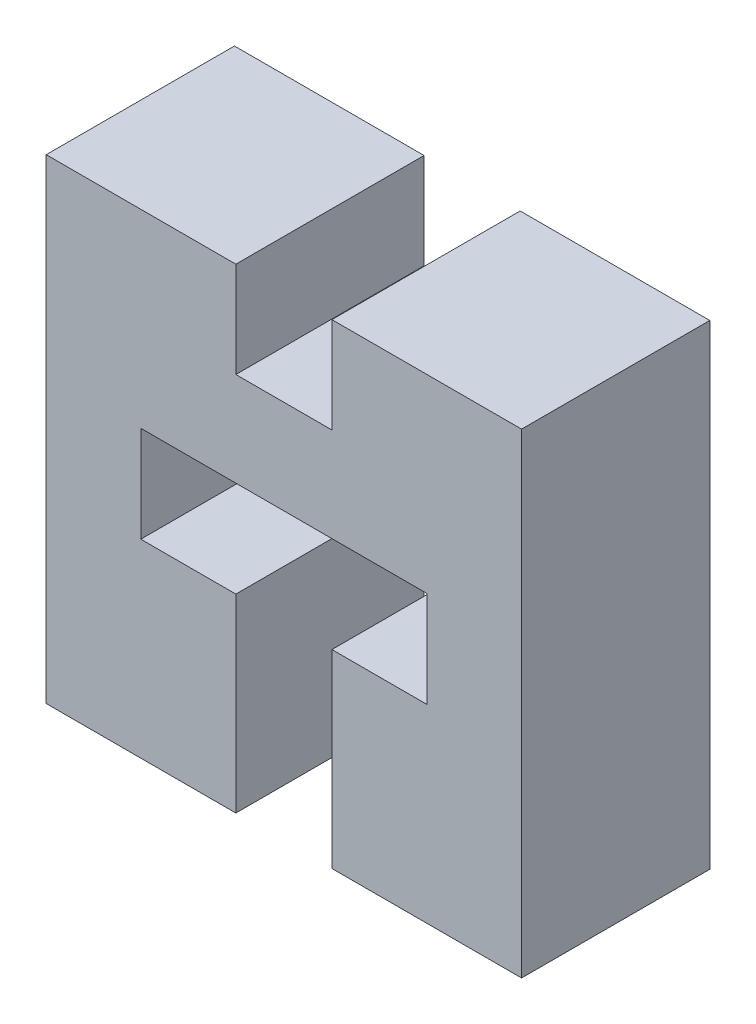
ISO-10303-21;
HEADER;
FILE_DESCRIPTION(('STEP AP214'),'2;1');
FILE_NAME('part.step','',(''),(''),'','','');
FILE_SCHEMA(('AUTOMOTIVE_DESIGN { 1 0 10303 214 1 1 1 1 }'));
ENDSEC;
DATA;
#1=APPLICATION_CONTEXT('core data for automotive mechanical design processes');
#2=APPLICATION_PROTOCOL_DEFINITION('international standard','automotive_design',2000,#1);
#3=PRODUCT_CONTEXT('',#1,'mechanical');
#4=PRODUCT('Part','Part','',(#3));
#5=PRODUCT_RELATED_PRODUCT_CATEGORY('part','',(#4));
#6=PRODUCT_DEFINITION_FORMATION('','',#4);
#7=PRODUCT_DEFINITION_CONTEXT('part definition',#1,'design');
#8=PRODUCT_DEFINITION('design','',#6,#7);
#9=PRODUCT_DEFINITION_SHAPE('','',#8);
#10=(LENGTH_UNIT() NAMED_UNIT(*) SI_UNIT(.MILLI.,.METRE.));
#11=(NAMED_UNIT(*) PLANE_ANGLE_UNIT() SI_UNIT($,.RADIAN.));
#12=(NAMED_UNIT(*) SI_UNIT($,.STERADIAN.) SOLID_ANGLE_UNIT());
#13=UNCERTAINTY_MEASURE_WITH_UNIT(LENGTH_MEASURE(1.E-05),#10,'distance_accuracy_value','');
#14=(GEOMETRIC_REPRESENTATION_CONTEXT(3) GLOBAL_UNCERTAINTY_ASSIGNED_CONTEXT((#13)) GLOBAL_UNIT_ASSIGNED_CONTEXT((#10,
#11,#12)) REPRESENTATION_CONTEXT('',''));
#15=CARTESIAN_POINT('',(0.,0.,0.));
#16=DIRECTION('',(0.,0.,1.));
#17=DIRECTION('',(1.,0.,0.));
#18=AXIS2_PLACEMENT_3D('',#15,#16,#17);
#19=CARTESIAN_POINT('',(19.9734994027987,9.97349977532775,0.));
#20=DIRECTION('',(0.,1.,0.));
#21=DIRECTION('',(0.,0.,1.));
#22=AXIS2_PLACEMENT_3D('',#19,#20,#21);
#23=PLANE('',#22);
#24=DIRECTION('',(-1.,0.,0.));
#25=VECTOR('',#24,1.);
#26=CARTESIAN_POINT('',(19.9734994027987,9.97349977532775,9.89999994635582));
#27=LINE('',#26,#25);
#28=CARTESIAN_POINT('',(19.9734994027987,9.97349977532775,9.89999994635582));
#29=VERTEX_POINT('',#28);
#30=CARTESIAN_POINT('',(14.9739997092783,9.97349977532775,9.89999994635582));
#31=VERTEX_POINT('',#30);
#32=EDGE_CURVE('E194',#29,#31,#27,.T.);
#33=ORIENTED_EDGE('',*,*,#32,.F.);
#34=DIRECTION('',(0.,0.,1.));
#35=VECTOR('',#34,1.);
#36=CARTESIAN_POINT('',(19.9734994027987,9.97349977532775,0.));
#37=LINE('',#36,#35);
#38=CARTESIAN_POINT('',(19.9734994027987,9.97349977532775,0.));
#39=VERTEX_POINT('',#38);
#40=EDGE_CURVE('E11',#39,#29,#37,.T.);
#41=ORIENTED_EDGE('',*,*,#40,.F.);
#42=DIRECTION('',(-1.,0.,0.));
#43=VECTOR('',#42,1.);
#44=CARTESIAN_POINT('',(19.9734994027987,9.97349977532775,0.));
#45=LINE('',#44,#43);
#46=CARTESIAN_POINT('',(14.9739997092783,9.97349977532775,0.));
#47=VERTEX_POINT('',#46);
#48=EDGE_CURVE('E254',#39,#47,#45,.T.);
#49=ORIENTED_EDGE('',*,*,#48,.T.);
#50=DIRECTION('',(0.,0.,1.));
#51=VECTOR('',#50,1.);
#52=CARTESIAN_POINT('',(14.9739997092783,9.97349977532775,0.));
#53=LINE('',#52,#51);
#54=EDGE_CURVE('E46',#47,#31,#53,.T.);
#55=ORIENTED_EDGE('',*,*,#54,.T.);
#56=EDGE_LOOP('',(#33,#41,#49,#55));
#57=FACE_BOUND('',#56,.T.);
#58=ADVANCED_FACE('F43',(#57),#23,.T.);
#59=CARTESIAN_POINT('',(19.9734994027987,0.,0.));
#60=DIRECTION('',(1.,0.,0.));
#61=DIRECTION('',(0.,0.,-1.));
#62=AXIS2_PLACEMENT_3D('',#59,#60,#61);
#63=PLANE('',#62);
#64=DIRECTION('',(0.,1.,0.));
#65=VECTOR('',#64,1.);
#66=CARTESIAN_POINT('',(19.9734994027987,0.,9.89999994635582));
#67=LINE('',#66,#65);
#68=CARTESIAN_POINT('',(19.9734994027987,0.,9.89999994635582));
#69=VERTEX_POINT('',#68);
#70=EDGE_CURVE('E251',#69,#29,#67,.T.);
#71=ORIENTED_EDGE('',*,*,#70,.F.);
#72=DIRECTION('',(0.,0.,1.));
#73=VECTOR('',#72,1.);
#74=CARTESIAN_POINT('',(19.9734994027987,0.,0.));
#75=LINE('',#74,#73);
#76=CARTESIAN_POINT('',(19.9734994027987,0.,0.));
#77=VERTEX_POINT('',#76);
#78=EDGE_CURVE('E53',#77,#69,#75,.T.);
#79=ORIENTED_EDGE('',*,*,#78,.F.);
#80=DIRECTION('',(0.,1.,0.));
#81=VECTOR('',#80,1.);
#82=CARTESIAN_POINT('',(19.9734994027987,0.,0.));
#83=LINE('',#82,#81);
#84=EDGE_CURVE('E180',#77,#39,#83,.T.);
#85=ORIENTED_EDGE('',*,*,#84,.T.);
#86=ORIENTED_EDGE('',*,*,#40,.T.);
#87=EDGE_LOOP('',(#71,#79,#85,#86));
#88=FACE_BOUND('',#87,.T.);
#89=ADVANCED_FACE('F296',(#88),#63,.T.);
#90=CARTESIAN_POINT('',(9.99999962747098,0.,0.));
#91=DIRECTION('',(0.,-1.,0.));
#92=DIRECTION('',(0.,0.,-1.));
#93=AXIS2_PLACEMENT_3D('',#90,#91,#92);
#94=PLANE('',#93);
#95=DIRECTION('',(1.,0.,0.));
#96=VECTOR('',#95,1.);
#97=CARTESIAN_POINT('',(9.99999962747098,0.,9.89999994635582));
#98=LINE('',#97,#96);
#99=CARTESIAN_POINT('',(9.99999962747098,0.,9.89999994635582));
#100=VERTEX_POINT('',#99);
#101=EDGE_CURVE('E166',#100,#69,#98,.T.);
#102=ORIENTED_EDGE('',*,*,#101,.F.);
#103=DIRECTION('',(0.,0.,1.));
#104=VECTOR('',#103,1.);
#105=CARTESIAN_POINT('',(9.99999962747098,0.,0.));
#106=LINE('',#105,#104);
#107=CARTESIAN_POINT('',(9.99999962747098,0.,0.));
#108=VERTEX_POINT('',#107);
#109=EDGE_CURVE('E161',#108,#100,#106,.T.);
#110=ORIENTED_EDGE('',*,*,#109,.F.);
#111=DIRECTION('',(1.,0.,0.));
#112=VECTOR('',#111,1.);
#113=CARTESIAN_POINT('',(9.99999962747098,0.,0.));
#114=LINE('',#113,#112);
#115=EDGE_CURVE('E164',#108,#77,#114,.T.);
#116=ORIENTED_EDGE('',*,*,#115,.T.);
#117=ORIENTED_EDGE('',*,*,#78,.T.);
#118=EDGE_LOOP('',(#102,#110,#116,#117));
#119=FACE_BOUND('',#118,.T.);
#120=ADVANCED_FACE('F163',(#119),#94,.T.);
#121=CARTESIAN_POINT('',(9.99999962747098,25.,0.));
#122=DIRECTION('',(-1.,0.,0.));
#123=DIRECTION('',(0.,0.,1.));
#124=AXIS2_PLACEMENT_3D('',#121,#122,#123);
#125=PLANE('',#124);
#126=DIRECTION('',(0.,-1.,0.));
#127=VECTOR('',#126,1.);
#128=CARTESIAN_POINT('',(9.99999962747098,25.,9.89999994635582));
#129=LINE('',#128,#127);
#130=CARTESIAN_POINT('',(9.99999962747098,25.,9.89999994635582));
#131=VERTEX_POINT('',#130);
#132=EDGE_CURVE('E246',#131,#100,#129,.T.);
#133=ORIENTED_EDGE('',*,*,#132,.F.);
#134=DIRECTION('',(0.,0.,1.));
#135=VECTOR('',#134,1.);
#136=CARTESIAN_POINT('',(9.99999962747098,25.,0.));
#137=LINE('',#136,#135);
#138=CARTESIAN_POINT('',(9.99999962747098,25.,0.));
#139=VERTEX_POINT('',#138);
#140=EDGE_CURVE('E172',#139,#131,#137,.T.);
#141=ORIENTED_EDGE('',*,*,#140,.F.);
#142=DIRECTION('',(0.,-1.,0.));
#143=VECTOR('',#142,1.);
#144=CARTESIAN_POINT('',(9.99999962747098,25.,0.));
#145=LINE('',#144,#143);
#146=EDGE_CURVE('E178',#139,#108,#145,.T.);
#147=ORIENTED_EDGE('',*,*,#146,.T.);
#148=ORIENTED_EDGE('',*,*,#109,.T.);
#149=EDGE_LOOP('',(#133,#141,#147,#148));
#150=FACE_BOUND('',#149,.T.);
#151=ADVANCED_FACE('F183',(#150),#125,.T.);
#152=CARTESIAN_POINT('',(19.9734994027987,25.,0.));
#153=DIRECTION('',(0.,1.,0.));
#154=DIRECTION('',(0.,0.,1.));
#155=AXIS2_PLACEMENT_3D('',#152,#153,#154);
#156=PLANE('',#155);
#157=DIRECTION('',(-1.,0.,0.));
#158=VECTOR('',#157,1.);
#159=CARTESIAN_POINT('',(19.9734994027987,25.,9.89999994635582));
#160=LINE('',#159,#158);
#161=CARTESIAN_POINT('',(19.9734994027987,25.,9.89999994635582));
#162=VERTEX_POINT('',#161);
#163=EDGE_CURVE('E242',#162,#131,#160,.T.);
#164=ORIENTED_EDGE('',*,*,#163,.F.);
#165=DIRECTION('',(0.,0.,1.));
#166=VECTOR('',#165,1.);
#167=CARTESIAN_POINT('',(19.9734994027987,25.,0.));
#168=LINE('',#167,#166);
#169=CARTESIAN_POINT('',(19.9734994027987,25.,0.));
#170=VERTEX_POINT('',#169);
#171=EDGE_CURVE('E260',#170,#162,#168,.T.);
#172=ORIENTED_EDGE('',*,*,#171,.F.);
#173=DIRECTION('',(-1.,0.,0.));
#174=VECTOR('',#173,1.);
#175=CARTESIAN_POINT('',(19.9734994027987,25.,0.));
#176=LINE('',#175,#174);
#177=EDGE_CURVE('E185',#170,#139,#176,.T.);
#178=ORIENTED_EDGE('',*,*,#177,.T.);
#179=ORIENTED_EDGE('',*,*,#140,.T.);
#180=EDGE_LOOP('',(#164,#172,#178,#179));
#181=FACE_BOUND('',#180,.T.);
#182=ADVANCED_FACE('F309',(#181),#156,.T.);
#183=CARTESIAN_POINT('',(19.9734994027987,19.9740004543364,0.));
#184=DIRECTION('',(1.,0.,0.));
#185=DIRECTION('',(0.,0.,-1.));
#186=AXIS2_PLACEMENT_3D('',#183,#184,#185);
#187=PLANE('',#186);
#188=DIRECTION('',(0.,1.,0.));
#189=VECTOR('',#188,1.);
#190=CARTESIAN_POINT('',(19.9734994027987,19.9740004543364,9.89999994635582));
#191=LINE('',#190,#189);
#192=CARTESIAN_POINT('',(19.9734994027987,19.9740004543364,9.89999994635582));
#193=VERTEX_POINT('',#192);
#194=EDGE_CURVE('E238',#193,#162,#191,.T.);
#195=ORIENTED_EDGE('',*,*,#194,.F.);
#196=DIRECTION('',(0.,0.,1.));
#197=VECTOR('',#196,1.);
#198=CARTESIAN_POINT('',(19.9734994027987,19.9740004543364,0.));
#199=LINE('',#198,#197);
#200=CARTESIAN_POINT('',(19.9734994027987,19.9740004543364,0.));
#201=VERTEX_POINT('',#200);
#202=EDGE_CURVE('E263',#201,#193,#199,.T.);
#203=ORIENTED_EDGE('',*,*,#202,.F.);
#204=DIRECTION('',(0.,1.,0.));
#205=VECTOR('',#204,1.);
#206=CARTESIAN_POINT('',(19.9734994027987,19.9740004543364,0.));
#207=LINE('',#206,#205);
#208=EDGE_CURVE('E188',#201,#170,#207,.T.);
#209=ORIENTED_EDGE('',*,*,#208,.T.);
#210=ORIENTED_EDGE('',*,*,#171,.T.);
#211=EDGE_LOOP('',(#195,#203,#209,#210));
#212=FACE_BOUND('',#211,.T.);
#213=ADVANCED_FACE('F312',(#212),#187,.T.);
#214=CARTESIAN_POINT('',(25.0264998521432,19.9740004543364,0.));
#215=DIRECTION('',(0.,1.,0.));
#216=DIRECTION('',(0.,0.,1.));
#217=AXIS2_PLACEMENT_3D('',#214,#215,#216);
#218=PLANE('',#217);
#219=DIRECTION('',(-1.,0.,0.));
#220=VECTOR('',#219,1.);
#221=CARTESIAN_POINT('',(25.0264998521432,19.9740004543364,9.89999994635582));
#222=LINE('',#221,#220);
#223=CARTESIAN_POINT('',(25.0264998521432,19.9740004543364,9.89999994635582));
#224=VERTEX_POINT('',#223);
#225=EDGE_CURVE('E234',#224,#193,#222,.T.);
#226=ORIENTED_EDGE('',*,*,#225,.F.);
#227=DIRECTION('',(0.,0.,1.));
#228=VECTOR('',#227,1.);
#229=CARTESIAN_POINT('',(25.0264998521432,19.9740004543364,0.));
#230=LINE('',#229,#228);
#231=CARTESIAN_POINT('',(25.0264998521432,19.9740004543364,0.));
#232=VERTEX_POINT('',#231);
#233=EDGE_CURVE('E266',#232,#224,#230,.T.);
#234=ORIENTED_EDGE('',*,*,#233,.F.);
#235=DIRECTION('',(-1.,0.,0.));
#236=VECTOR('',#235,1.);
#237=CARTESIAN_POINT('',(25.0264998521432,19.9740004543364,0.));
#238=LINE('',#237,#236);
#239=EDGE_CURVE('E529',#232,#201,#238,.T.);
#240=ORIENTED_EDGE('',*,*,#239,.T.);
#241=ORIENTED_EDGE('',*,*,#202,.T.);
#242=EDGE_LOOP('',(#226,#234,#240,#241));
#243=FACE_BOUND('',#242,.T.);
#244=ADVANCED_FACE('F316',(#243),#218,.T.);
#245=CARTESIAN_POINT('',(25.0264998521432,25.,0.));
#246=DIRECTION('',(-1.,0.,0.));
#247=DIRECTION('',(0.,0.,1.));
#248=AXIS2_PLACEMENT_3D('',#245,#246,#247);
#249=PLANE('',#248);
#250=DIRECTION('',(0.,-1.,0.));
#251=VECTOR('',#250,1.);
#252=CARTESIAN_POINT('',(25.0264998521432,25.,9.89999994635582));
#253=LINE('',#252,#251);
#254=CARTESIAN_POINT('',(25.0264998521432,25.,9.89999994635582));
#255=VERTEX_POINT('',#254);
#256=EDGE_CURVE('E230',#255,#224,#253,.T.);
#257=ORIENTED_EDGE('',*,*,#256,.F.);
#258=DIRECTION('',(0.,0.,1.));
#259=VECTOR('',#258,1.);
#260=CARTESIAN_POINT('',(25.0264998521432,25.,0.));
#261=LINE('',#260,#259);
#262=CARTESIAN_POINT('',(25.0264998521432,25.,0.));
#263=VERTEX_POINT('',#262);
#264=EDGE_CURVE('E269',#263,#255,#261,.T.);
#265=ORIENTED_EDGE('',*,*,#264,.F.);
#266=DIRECTION('',(0.,-1.,0.));
#267=VECTOR('',#266,1.);
#268=CARTESIAN_POINT('',(25.0264998521432,25.,0.));
#269=LINE('',#268,#267);
#270=EDGE_CURVE('E525',#263,#232,#269,.T.);
#271=ORIENTED_EDGE('',*,*,#270,.T.);
#272=ORIENTED_EDGE('',*,*,#233,.T.);
#273=EDGE_LOOP('',(#257,#265,#271,#272));
#274=FACE_BOUND('',#273,.T.);
#275=ADVANCED_FACE('F320',(#274),#249,.T.);
#276=CARTESIAN_POINT('',(34.999999627471,25.,0.));
#277=DIRECTION('',(0.,1.,0.));
#278=DIRECTION('',(0.,0.,1.));
#279=AXIS2_PLACEMENT_3D('',#276,#277,#278);
#280=PLANE('',#279);
#281=DIRECTION('',(-1.,0.,0.));
#282=VECTOR('',#281,1.);
#283=CARTESIAN_POINT('',(34.999999627471,25.,9.89999994635582));
#284=LINE('',#283,#282);
#285=CARTESIAN_POINT('',(34.999999627471,25.,9.89999994635582));
#286=VERTEX_POINT('',#285);
#287=EDGE_CURVE('E226',#286,#255,#284,.T.);
#288=ORIENTED_EDGE('',*,*,#287,.F.);
#289=DIRECTION('',(0.,0.,1.));
#290=VECTOR('',#289,1.);
#291=CARTESIAN_POINT('',(34.999999627471,25.,0.));
#292=LINE('',#291,#290);
#293=CARTESIAN_POINT('',(34.999999627471,25.,0.));
#294=VERTEX_POINT('',#293);
#295=EDGE_CURVE('E272',#294,#286,#292,.T.);
#296=ORIENTED_EDGE('',*,*,#295,.F.);
#297=DIRECTION('',(-1.,0.,0.));
#298=VECTOR('',#297,1.);
#299=CARTESIAN_POINT('',(34.999999627471,25.,0.));
#300=LINE('',#299,#298);
#301=EDGE_CURVE('E539',#294,#263,#300,.T.);
#302=ORIENTED_EDGE('',*,*,#301,.T.);
#303=ORIENTED_EDGE('',*,*,#264,.T.);
#304=EDGE_LOOP('',(#288,#296,#302,#303));
#305=FACE_BOUND('',#304,.T.);
#306=ADVANCED_FACE('F324',(#305),#280,.T.);
#307=CARTESIAN_POINT('',(34.999999627471,0.,0.));
#308=DIRECTION('',(1.,0.,0.));
#309=DIRECTION('',(0.,0.,-1.));
#310=AXIS2_PLACEMENT_3D('',#307,#308,#309);
#311=PLANE('',#310);
#312=DIRECTION('',(0.,1.,0.));
#313=VECTOR('',#312,1.);
#314=CARTESIAN_POINT('',(34.999999627471,0.,9.89999994635582));
#315=LINE('',#314,#313);
#316=CARTESIAN_POINT('',(34.999999627471,0.,9.89999994635582));
#317=VERTEX_POINT('',#316);
#318=EDGE_CURVE('E222',#317,#286,#315,.T.);
#319=ORIENTED_EDGE('',*,*,#318,.F.);
#320=DIRECTION('',(0.,0.,1.));
#321=VECTOR('',#320,1.);
#322=CARTESIAN_POINT('',(34.999999627471,0.,0.));
#323=LINE('',#322,#321);
#324=CARTESIAN_POINT('',(34.999999627471,0.,0.));
#325=VERTEX_POINT('',#324);
#326=EDGE_CURVE('E275',#325,#317,#323,.T.);
#327=ORIENTED_EDGE('',*,*,#326,.F.);
#328=DIRECTION('',(0.,1.,0.));
#329=VECTOR('',#328,1.);
#330=CARTESIAN_POINT('',(34.999999627471,0.,0.));
#331=LINE('',#330,#329);
#332=EDGE_CURVE('E518',#325,#294,#331,.T.);
#333=ORIENTED_EDGE('',*,*,#332,.T.);
#334=ORIENTED_EDGE('',*,*,#295,.T.);
#335=EDGE_LOOP('',(#319,#327,#333,#334));
#336=FACE_BOUND('',#335,.T.);
#337=ADVANCED_FACE('F328',(#336),#311,.T.);
#338=CARTESIAN_POINT('',(25.0264998521432,0.,0.));
#339=DIRECTION('',(0.,-1.,0.));
#340=DIRECTION('',(1.,0.,0.));
#341=AXIS2_PLACEMENT_3D('',#338,#339,#340);
#342=PLANE('',#341);
#343=DIRECTION('',(1.,0.,0.));
#344=VECTOR('',#343,1.);
#345=CARTESIAN_POINT('',(25.0264998521432,0.,9.89999994635582));
#346=LINE('',#345,#344);
#347=CARTESIAN_POINT('',(25.0264998521432,0.,9.89999994635582));
#348=VERTEX_POINT('',#347);
#349=EDGE_CURVE('E218',#348,#317,#346,.T.);
#350=ORIENTED_EDGE('',*,*,#349,.F.);
#351=DIRECTION('',(0.,0.,1.));
#352=VECTOR('',#351,1.);
#353=CARTESIAN_POINT('',(25.0264998521432,0.,0.));
#354=LINE('',#353,#352);
#355=CARTESIAN_POINT('',(25.0264998521432,0.,0.));
#356=VERTEX_POINT('',#355);
#357=EDGE_CURVE('E278',#356,#348,#354,.T.);
#358=ORIENTED_EDGE('',*,*,#357,.F.);
#359=DIRECTION('',(1.,0.,0.));
#360=VECTOR('',#359,1.);
#361=CARTESIAN_POINT('',(25.0264998521432,0.,0.));
#362=LINE('',#361,#360);
#363=EDGE_CURVE('E514',#356,#325,#362,.T.);
#364=ORIENTED_EDGE('',*,*,#363,.T.);
#365=ORIENTED_EDGE('',*,*,#326,.T.);
#366=EDGE_LOOP('',(#350,#358,#364,#365));
#367=FACE_BOUND('',#366,.T.);
#368=ADVANCED_FACE('F332',(#367),#342,.T.);
#369=CARTESIAN_POINT('',(25.0264998521432,9.97349977532775,0.));
#370=DIRECTION('',(-1.,0.,0.));
#371=DIRECTION('',(0.,0.,1.));
#372=AXIS2_PLACEMENT_3D('',#369,#370,#371);
#373=PLANE('',#372);
#374=DIRECTION('',(0.,-1.,0.));
#375=VECTOR('',#374,1.);
#376=CARTESIAN_POINT('',(25.0264998521432,9.97349977532775,9.89999994635582));
#377=LINE('',#376,#375);
#378=CARTESIAN_POINT('',(25.0264998521432,9.97349977532775,9.89999994635582));
#379=VERTEX_POINT('',#378);
#380=EDGE_CURVE('E214',#379,#348,#377,.T.);
#381=ORIENTED_EDGE('',*,*,#380,.F.);
#382=DIRECTION('',(0.,0.,1.));
#383=VECTOR('',#382,1.);
#384=CARTESIAN_POINT('',(25.0264998521432,9.97349977532775,0.));
#385=LINE('',#384,#383);
#386=CARTESIAN_POINT('',(25.0264998521432,9.97349977532775,0.));
#387=VERTEX_POINT('',#386);
#388=EDGE_CURVE('E281',#387,#379,#385,.T.);
#389=ORIENTED_EDGE('',*,*,#388,.F.);
#390=DIRECTION('',(0.,-1.,0.));
#391=VECTOR('',#390,1.);
#392=CARTESIAN_POINT('',(25.0264998521432,9.97349977532775,0.));
#393=LINE('',#392,#391);
#394=EDGE_CURVE('E546',#387,#356,#393,.T.);
#395=ORIENTED_EDGE('',*,*,#394,.T.);
#396=ORIENTED_EDGE('',*,*,#357,.T.);
#397=EDGE_LOOP('',(#381,#389,#395,#396));
#398=FACE_BOUND('',#397,.T.);
#399=ADVANCED_FACE('F336',(#398),#373,.T.);
#400=CARTESIAN_POINT('',(30.0265005972013,9.97349977532775,0.));
#401=DIRECTION('',(0.,1.,0.));
#402=DIRECTION('',(0.,0.,1.));
#403=AXIS2_PLACEMENT_3D('',#400,#401,#402);
#404=PLANE('',#403);
#405=DIRECTION('',(-1.,0.,0.));
#406=VECTOR('',#405,1.);
#407=CARTESIAN_POINT('',(30.0265005972013,9.97349977532775,9.89999994635582));
#408=LINE('',#407,#406);
#409=CARTESIAN_POINT('',(30.0265005972013,9.97349977532775,9.89999994635582));
#410=VERTEX_POINT('',#409);
#411=EDGE_CURVE('E210',#410,#379,#408,.T.);
#412=ORIENTED_EDGE('',*,*,#411,.F.);
#413=DIRECTION('',(0.,0.,1.));
#414=VECTOR('',#413,1.);
#415=CARTESIAN_POINT('',(30.0265005972013,9.97349977532775,0.));
#416=LINE('',#415,#414);
#417=CARTESIAN_POINT('',(30.0265005972013,9.97349977532775,0.));
#418=VERTEX_POINT('',#417);
#419=EDGE_CURVE('E284',#418,#410,#416,.T.);
#420=ORIENTED_EDGE('',*,*,#419,.F.);
#421=DIRECTION('',(-1.,0.,0.));
#422=VECTOR('',#421,1.);
#423=CARTESIAN_POINT('',(30.0265005972013,9.97349977532775,0.));
#424=LINE('',#423,#422);
#425=EDGE_CURVE('E507',#418,#387,#424,.T.);
#426=ORIENTED_EDGE('',*,*,#425,.T.);
#427=ORIENTED_EDGE('',*,*,#388,.T.);
#428=EDGE_LOOP('',(#412,#420,#426,#427));
#429=FACE_BOUND('',#428,.T.);
#430=ADVANCED_FACE('F340',(#429),#404,.T.);
#431=CARTESIAN_POINT('',(30.0265005972013,15.0264992933497,0.));
#432=DIRECTION('',(-1.,0.,0.));
#433=DIRECTION('',(0.,0.,1.));
#434=AXIS2_PLACEMENT_3D('',#431,#432,#433);
#435=PLANE('',#434);
#436=DIRECTION('',(0.,-1.,0.));
#437=VECTOR('',#436,1.);
#438=CARTESIAN_POINT('',(30.0265005972013,15.0264992933497,9.89999994635582));
#439=LINE('',#438,#437);
#440=CARTESIAN_POINT('',(30.0265005972013,15.0264992933497,9.89999994635582));
#441=VERTEX_POINT('',#440);
#442=EDGE_CURVE('E206',#441,#410,#439,.T.);
#443=ORIENTED_EDGE('',*,*,#442,.F.);
#444=DIRECTION('',(0.,0.,1.));
#445=VECTOR('',#444,1.);
#446=CARTESIAN_POINT('',(30.0265005972013,15.0264992933497,0.));
#447=LINE('',#446,#445);
#448=CARTESIAN_POINT('',(30.0265005972013,15.0264992933497,0.));
#449=VERTEX_POINT('',#448);
#450=EDGE_CURVE('E287',#449,#441,#447,.T.);
#451=ORIENTED_EDGE('',*,*,#450,.F.);
#452=DIRECTION('',(0.,-1.,0.));
#453=VECTOR('',#452,1.);
#454=CARTESIAN_POINT('',(30.0265005972013,15.0264992933497,0.));
#455=LINE('',#454,#453);
#456=EDGE_CURVE('E503',#449,#418,#455,.T.);
#457=ORIENTED_EDGE('',*,*,#456,.T.);
#458=ORIENTED_EDGE('',*,*,#419,.T.);
#459=EDGE_LOOP('',(#443,#451,#457,#458));
#460=FACE_BOUND('',#459,.T.);
#461=ADVANCED_FACE('F344',(#460),#435,.T.);
#462=CARTESIAN_POINT('',(14.9739997092783,15.0264992933497,0.));
#463=DIRECTION('',(0.,-1.,0.));
#464=DIRECTION('',(0.,0.,-1.));
#465=AXIS2_PLACEMENT_3D('',#462,#463,#464);
#466=PLANE('',#465);
#467=DIRECTION('',(1.,0.,0.));
#468=VECTOR('',#467,1.);
#469=CARTESIAN_POINT('',(14.9739997092783,15.0264992933497,9.89999994635582));
#470=LINE('',#469,#468);
#471=CARTESIAN_POINT('',(14.9739997092783,15.0264992933497,9.89999994635582));
#472=VERTEX_POINT('',#471);
#473=EDGE_CURVE('E202',#472,#441,#470,.T.);
#474=ORIENTED_EDGE('',*,*,#473,.F.);
#475=DIRECTION('',(0.,0.,1.));
#476=VECTOR('',#475,1.);
#477=CARTESIAN_POINT('',(14.9739997092783,15.0264992933497,0.));
#478=LINE('',#477,#476);
#479=CARTESIAN_POINT('',(14.9739997092783,15.0264992933497,0.));
#480=VERTEX_POINT('',#479);
#481=EDGE_CURVE('E289',#480,#472,#478,.T.);
#482=ORIENTED_EDGE('',*,*,#481,.F.);
#483=DIRECTION('',(1.,0.,0.));
#484=VECTOR('',#483,1.);
#485=CARTESIAN_POINT('',(14.9739997092783,15.0264992933497,0.));
#486=LINE('',#485,#484);
#487=EDGE_CURVE('E553',#480,#449,#486,.T.);
#488=ORIENTED_EDGE('',*,*,#487,.T.);
#489=ORIENTED_EDGE('',*,*,#450,.T.);
#490=EDGE_LOOP('',(#474,#482,#488,#489));
#491=FACE_BOUND('',#490,.T.);
#492=ADVANCED_FACE('F348',(#491),#466,.T.);
#493=CARTESIAN_POINT('',(14.9739997092783,9.97349977532775,0.));
#494=DIRECTION('',(1.,0.,0.));
#495=DIRECTION('',(0.,0.,-1.));
#496=AXIS2_PLACEMENT_3D('',#493,#494,#495);
#497=PLANE('',#496);
#498=DIRECTION('',(0.,1.,0.));
#499=VECTOR('',#498,1.);
#500=CARTESIAN_POINT('',(14.9739997092783,9.97349977532775,9.89999994635582));
#501=LINE('',#500,#499);
#502=EDGE_CURVE('E198',#31,#472,#501,.T.);
#503=ORIENTED_EDGE('',*,*,#502,.F.);
#504=ORIENTED_EDGE('',*,*,#54,.F.);
#505=DIRECTION('',(0.,1.,0.));
#506=VECTOR('',#505,1.);
#507=CARTESIAN_POINT('',(14.9739997092783,9.97349977532775,0.));
#508=LINE('',#507,#506);
#509=EDGE_CURVE('E556',#47,#480,#508,.T.);
#510=ORIENTED_EDGE('',*,*,#509,.T.);
#511=ORIENTED_EDGE('',*,*,#481,.T.);
#512=EDGE_LOOP('',(#503,#504,#510,#511));
#513=FACE_BOUND('',#512,.T.);
#514=ADVANCED_FACE('F293',(#513),#497,.T.);
#515=CARTESIAN_POINT('',(0.,0.,0.));
#516=DIRECTION('',(0.,0.,-1.));
#517=DIRECTION('',(-1.,0.,0.));
#518=AXIS2_PLACEMENT_3D('',#515,#516,#517);
#519=PLANE('',#518);
#520=ORIENTED_EDGE('',*,*,#48,.F.);
#521=ORIENTED_EDGE('',*,*,#84,.F.);
#522=ORIENTED_EDGE('',*,*,#115,.F.);
#523=ORIENTED_EDGE('',*,*,#146,.F.);
#524=ORIENTED_EDGE('',*,*,#177,.F.);
#525=ORIENTED_EDGE('',*,*,#208,.F.);
#526=ORIENTED_EDGE('',*,*,#239,.F.);
#527=ORIENTED_EDGE('',*,*,#270,.F.);
#528=ORIENTED_EDGE('',*,*,#301,.F.);
#529=ORIENTED_EDGE('',*,*,#332,.F.);
#530=ORIENTED_EDGE('',*,*,#363,.F.);
#531=ORIENTED_EDGE('',*,*,#394,.F.);
#532=ORIENTED_EDGE('',*,*,#425,.F.);
#533=ORIENTED_EDGE('',*,*,#456,.F.);
#534=ORIENTED_EDGE('',*,*,#487,.F.);
#535=ORIENTED_EDGE('',*,*,#509,.F.);
#536=EDGE_LOOP('',(#520,#521,#522,#523,#524,#525,#526,#527,#528,#529,#530,#531,#532,#533,#534,#535));
#537=FACE_BOUND('',#536,.T.);
#538=ADVANCED_FACE('F176',(#537),#519,.T.);
#539=CARTESIAN_POINT('',(0.,0.,9.89999994635582));
#540=DIRECTION('',(0.,0.,-1.));
#541=DIRECTION('',(-1.,0.,0.));
#542=AXIS2_PLACEMENT_3D('',#539,#540,#541);
#543=PLANE('',#542);
#544=ORIENTED_EDGE('',*,*,#32,.T.);
#545=ORIENTED_EDGE('',*,*,#502,.T.);
#546=ORIENTED_EDGE('',*,*,#473,.T.);
#547=ORIENTED_EDGE('',*,*,#442,.T.);
#548=ORIENTED_EDGE('',*,*,#411,.T.);
#549=ORIENTED_EDGE('',*,*,#380,.T.);
#550=ORIENTED_EDGE('',*,*,#349,.T.);
#551=ORIENTED_EDGE('',*,*,#318,.T.);
#552=ORIENTED_EDGE('',*,*,#287,.T.);
#553=ORIENTED_EDGE('',*,*,#256,.T.);
#554=ORIENTED_EDGE('',*,*,#225,.T.);
#555=ORIENTED_EDGE('',*,*,#194,.T.);
#556=ORIENTED_EDGE('',*,*,#163,.T.);
#557=ORIENTED_EDGE('',*,*,#132,.T.);
#558=ORIENTED_EDGE('',*,*,#101,.T.);
#559=ORIENTED_EDGE('',*,*,#70,.T.);
#560=EDGE_LOOP('',(#544,#545,#546,#547,#548,#549,#550,#551,#552,#553,#554,#555,#556,#557,#558,#559));
#561=FACE_BOUND('',#560,.T.);
#562=ADVANCED_FACE('F295',(#561),#543,.F.);
#563=CLOSED_SHELL('',(#58,#89,#120,#151,#182,#213,#244,#275,#306,#337,#368,#399,#430,#461,#492,
#514,#538,#562));
#564=MANIFOLD_SOLID_BREP('B2',#563);
#565=ADVANCED_BREP_SHAPE_REPRESENTATION('',(#18,#564),#14);
#566=SHAPE_DEFINITION_REPRESENTATION(#9,#565);
ENDSEC;
END-ISO-10303-21;
